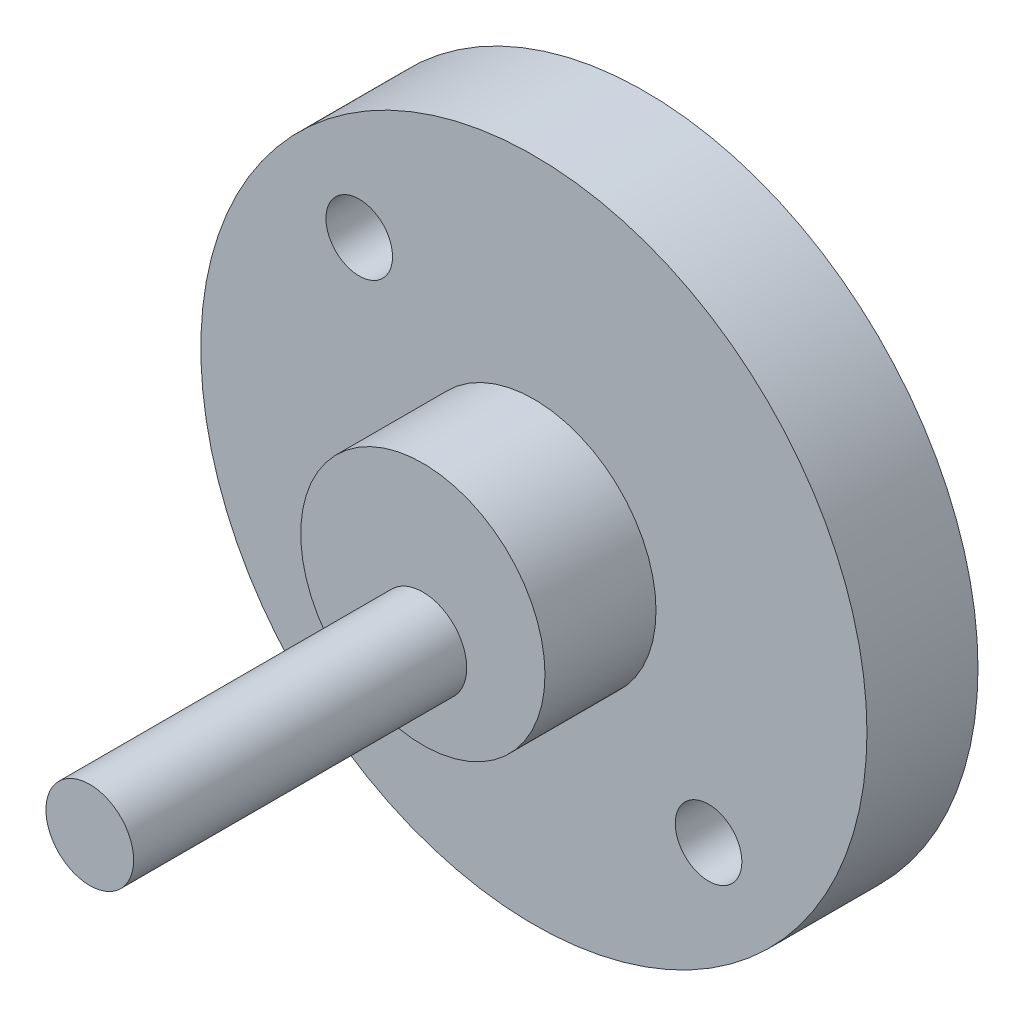
ISO-10303-21;
HEADER;
FILE_DESCRIPTION(('STEP AP214'),'2;1');
FILE_NAME('part.step','',(''),(''),'','','');
FILE_SCHEMA(('AUTOMOTIVE_DESIGN { 1 0 10303 214 1 1 1 1 }'));
ENDSEC;
DATA;
#1=APPLICATION_CONTEXT('core data for automotive mechanical design processes');
#2=APPLICATION_PROTOCOL_DEFINITION('international standard','automotive_design',2000,#1);
#3=PRODUCT_CONTEXT('',#1,'mechanical');
#4=PRODUCT('Part','Part','',(#3));
#5=PRODUCT_RELATED_PRODUCT_CATEGORY('part','',(#4));
#6=PRODUCT_DEFINITION_FORMATION('','',#4);
#7=PRODUCT_DEFINITION_CONTEXT('part definition',#1,'design');
#8=PRODUCT_DEFINITION('design','',#6,#7);
#9=PRODUCT_DEFINITION_SHAPE('','',#8);
#10=(LENGTH_UNIT() NAMED_UNIT(*) SI_UNIT(.MILLI.,.METRE.));
#11=(NAMED_UNIT(*) PLANE_ANGLE_UNIT() SI_UNIT($,.RADIAN.));
#12=(NAMED_UNIT(*) SI_UNIT($,.STERADIAN.) SOLID_ANGLE_UNIT());
#13=UNCERTAINTY_MEASURE_WITH_UNIT(LENGTH_MEASURE(1.E-05),#10,'distance_accuracy_value','');
#14=(GEOMETRIC_REPRESENTATION_CONTEXT(3) GLOBAL_UNCERTAINTY_ASSIGNED_CONTEXT((#13)) GLOBAL_UNIT_ASSIGNED_CONTEXT((#10,
#11,#12)) REPRESENTATION_CONTEXT('',''));
#15=CARTESIAN_POINT('',(0.,0.,0.));
#16=DIRECTION('',(0.,0.,1.));
#17=DIRECTION('',(1.,0.,0.));
#18=AXIS2_PLACEMENT_3D('',#15,#16,#17);
#19=CARTESIAN_POINT('',(0.,0.,20.));
#20=DIRECTION('',(0.,0.,1.));
#21=DIRECTION('',(1.,0.,0.));
#22=AXIS2_PLACEMENT_3D('',#19,#20,#21);
#23=PLANE('',#22);
#24=CARTESIAN_POINT('',(0.,0.,20.));
#25=DIRECTION('',(0.,0.,1.));
#26=DIRECTION('',(1.,0.,0.));
#27=AXIS2_PLACEMENT_3D('',#24,#25,#26);
#28=CIRCLE('',#27,11.);
#29=CARTESIAN_POINT('',(11.,0.,20.));
#30=VERTEX_POINT('',#29);
#31=EDGE_CURVE('E60',#30,#30,#28,.T.);
#32=ORIENTED_EDGE('',*,*,#31,.T.);
#33=EDGE_LOOP('',(#32));
#34=FACE_BOUND('',#33,.T.);
#35=CARTESIAN_POINT('',(0.,-3.,20.));
#36=DIRECTION('',(0.,0.,1.));
#37=DIRECTION('',(1.,0.,0.));
#38=AXIS2_PLACEMENT_3D('',#35,#36,#37);
#39=CIRCLE('',#38,3.95);
#40=CARTESIAN_POINT('',(3.95,-3.,20.));
#41=VERTEX_POINT('',#40);
#42=EDGE_CURVE('E67',#41,#41,#39,.T.);
#43=ORIENTED_EDGE('',*,*,#42,.F.);
#44=EDGE_LOOP('',(#43));
#45=FACE_BOUND('',#44,.T.);
#46=ADVANCED_FACE('F30',(#34,#45),#23,.T.);
#47=CARTESIAN_POINT('',(0.,0.,10.));
#48=DIRECTION('',(0.,0.,1.));
#49=DIRECTION('',(1.,0.,0.));
#50=AXIS2_PLACEMENT_3D('',#47,#48,#49);
#51=PLANE('',#50);
#52=CARTESIAN_POINT('',(0.,0.,10.));
#53=DIRECTION('',(0.,0.,1.));
#54=DIRECTION('',(1.,0.,0.));
#55=AXIS2_PLACEMENT_3D('',#52,#53,#54);
#56=CIRCLE('',#55,30.);
#57=CARTESIAN_POINT('',(30.,0.,10.));
#58=VERTEX_POINT('',#57);
#59=EDGE_CURVE('E10',#58,#58,#56,.T.);
#60=ORIENTED_EDGE('',*,*,#59,.T.);
#61=EDGE_LOOP('',(#60));
#62=FACE_BOUND('',#61,.T.);
#63=CARTESIAN_POINT('',(-15.7331258814007,-15.7331258814007,10.));
#64=DIRECTION('',(0.,0.,1.));
#65=DIRECTION('',(1.,0.,0.));
#66=AXIS2_PLACEMENT_3D('',#63,#64,#65);
#67=CIRCLE('',#66,3.);
#68=CARTESIAN_POINT('',(-12.7331258814007,-15.7331258814007,10.));
#69=VERTEX_POINT('',#68);
#70=EDGE_CURVE('E45',#69,#69,#67,.T.);
#71=ORIENTED_EDGE('',*,*,#70,.F.);
#72=EDGE_LOOP('',(#71));
#73=FACE_BOUND('',#72,.T.);
#74=CARTESIAN_POINT('',(15.7331258814007,-15.7331258814007,10.));
#75=DIRECTION('',(0.,0.,1.));
#76=DIRECTION('',(1.,0.,0.));
#77=AXIS2_PLACEMENT_3D('',#74,#75,#76);
#78=CIRCLE('',#77,3.);
#79=CARTESIAN_POINT('',(18.7331258814007,-15.7331258814007,10.));
#80=VERTEX_POINT('',#79);
#81=EDGE_CURVE('E51',#80,#80,#78,.T.);
#82=ORIENTED_EDGE('',*,*,#81,.F.);
#83=EDGE_LOOP('',(#82));
#84=FACE_BOUND('',#83,.T.);
#85=CARTESIAN_POINT('',(-15.7331258814007,15.7331258814007,10.));
#86=DIRECTION('',(0.,0.,1.));
#87=DIRECTION('',(1.,0.,0.));
#88=AXIS2_PLACEMENT_3D('',#85,#86,#87);
#89=CIRCLE('',#88,3.);
#90=CARTESIAN_POINT('',(-12.7331258814007,15.7331258814007,10.));
#91=VERTEX_POINT('',#90);
#92=EDGE_CURVE('E57',#91,#91,#89,.T.);
#93=ORIENTED_EDGE('',*,*,#92,.F.);
#94=EDGE_LOOP('',(#93));
#95=FACE_BOUND('',#94,.T.);
#96=CARTESIAN_POINT('',(0.,0.,10.));
#97=DIRECTION('',(0.,0.,1.));
#98=DIRECTION('',(1.,0.,0.));
#99=AXIS2_PLACEMENT_3D('',#96,#97,#98);
#100=CIRCLE('',#99,11.);
#101=CARTESIAN_POINT('',(11.,0.,10.));
#102=VERTEX_POINT('',#101);
#103=EDGE_CURVE('E61',#102,#102,#100,.T.);
#104=ORIENTED_EDGE('',*,*,#103,.F.);
#105=EDGE_LOOP('',(#104));
#106=FACE_BOUND('',#105,.T.);
#107=ADVANCED_FACE('F83',(#62,#73,#84,#95,#106),#51,.T.);
#108=CARTESIAN_POINT('',(0.,0.,10.));
#109=DIRECTION('',(0.,0.,-1.));
#110=DIRECTION('',(-1.,0.,0.));
#111=AXIS2_PLACEMENT_3D('',#108,#109,#110);
#112=CYLINDRICAL_SURFACE('',#111,30.);
#113=ORIENTED_EDGE('',*,*,#59,.F.);
#114=EDGE_LOOP('',(#113));
#115=FACE_BOUND('',#114,.T.);
#116=CARTESIAN_POINT('',(0.,0.,0.));
#117=DIRECTION('',(0.,0.,1.));
#118=DIRECTION('',(1.,0.,0.));
#119=AXIS2_PLACEMENT_3D('',#116,#117,#118);
#120=CIRCLE('',#119,30.);
#121=CARTESIAN_POINT('',(30.,0.,0.));
#122=VERTEX_POINT('',#121);
#123=EDGE_CURVE('E34',#122,#122,#120,.T.);
#124=ORIENTED_EDGE('',*,*,#123,.T.);
#125=EDGE_LOOP('',(#124));
#126=FACE_BOUND('',#125,.T.);
#127=ADVANCED_FACE('F32',(#115,#126),#112,.T.);
#128=CARTESIAN_POINT('',(0.,0.,0.));
#129=DIRECTION('',(0.,0.,1.));
#130=DIRECTION('',(1.,0.,0.));
#131=AXIS2_PLACEMENT_3D('',#128,#129,#130);
#132=PLANE('',#131);
#133=CARTESIAN_POINT('',(-15.7331258814007,15.7331258814007,0.));
#134=DIRECTION('',(0.,0.,1.));
#135=DIRECTION('',(1.,0.,0.));
#136=AXIS2_PLACEMENT_3D('',#133,#134,#135);
#137=CIRCLE('',#136,3.);
#138=CARTESIAN_POINT('',(-12.7331258814007,15.7331258814007,0.));
#139=VERTEX_POINT('',#138);
#140=EDGE_CURVE('E54',#139,#139,#137,.T.);
#141=ORIENTED_EDGE('',*,*,#140,.T.);
#142=EDGE_LOOP('',(#141));
#143=FACE_BOUND('',#142,.T.);
#144=CARTESIAN_POINT('',(15.7331258814007,-15.7331258814007,0.));
#145=DIRECTION('',(0.,0.,1.));
#146=DIRECTION('',(1.,0.,0.));
#147=AXIS2_PLACEMENT_3D('',#144,#145,#146);
#148=CIRCLE('',#147,3.);
#149=CARTESIAN_POINT('',(18.7331258814007,-15.7331258814007,0.));
#150=VERTEX_POINT('',#149);
#151=EDGE_CURVE('E48',#150,#150,#148,.T.);
#152=ORIENTED_EDGE('',*,*,#151,.T.);
#153=EDGE_LOOP('',(#152));
#154=FACE_BOUND('',#153,.T.);
#155=CARTESIAN_POINT('',(-15.7331258814007,-15.7331258814007,0.));
#156=DIRECTION('',(0.,0.,1.));
#157=DIRECTION('',(1.,0.,0.));
#158=AXIS2_PLACEMENT_3D('',#155,#156,#157);
#159=CIRCLE('',#158,3.);
#160=CARTESIAN_POINT('',(-12.7331258814007,-15.7331258814007,0.));
#161=VERTEX_POINT('',#160);
#162=EDGE_CURVE('E41',#161,#161,#159,.T.);
#163=ORIENTED_EDGE('',*,*,#162,.T.);
#164=EDGE_LOOP('',(#163));
#165=FACE_BOUND('',#164,.T.);
#166=ORIENTED_EDGE('',*,*,#123,.F.);
#167=EDGE_LOOP('',(#166));
#168=FACE_BOUND('',#167,.T.);
#169=ADVANCED_FACE('F105',(#143,#154,#165,#168),#132,.F.);
#170=CARTESIAN_POINT('',(-15.7331258814007,-15.7331258814007,10.));
#171=DIRECTION('',(0.,0.,1.));
#172=DIRECTION('',(1.,0.,0.));
#173=AXIS2_PLACEMENT_3D('',#170,#171,#172);
#174=CYLINDRICAL_SURFACE('',#173,3.);
#175=ORIENTED_EDGE('',*,*,#162,.F.);
#176=EDGE_LOOP('',(#175));
#177=FACE_BOUND('',#176,.T.);
#178=ORIENTED_EDGE('',*,*,#70,.T.);
#179=EDGE_LOOP('',(#178));
#180=FACE_BOUND('',#179,.T.);
#181=ADVANCED_FACE('F102',(#177,#180),#174,.F.);
#182=CARTESIAN_POINT('',(15.7331258814007,-15.7331258814007,10.));
#183=DIRECTION('',(0.,0.,1.));
#184=DIRECTION('',(1.,0.,0.));
#185=AXIS2_PLACEMENT_3D('',#182,#183,#184);
#186=CYLINDRICAL_SURFACE('',#185,3.);
#187=ORIENTED_EDGE('',*,*,#151,.F.);
#188=EDGE_LOOP('',(#187));
#189=FACE_BOUND('',#188,.T.);
#190=ORIENTED_EDGE('',*,*,#81,.T.);
#191=EDGE_LOOP('',(#190));
#192=FACE_BOUND('',#191,.T.);
#193=ADVANCED_FACE('F98',(#189,#192),#186,.F.);
#194=CARTESIAN_POINT('',(-15.7331258814007,15.7331258814007,10.));
#195=DIRECTION('',(0.,0.,1.));
#196=DIRECTION('',(1.,0.,0.));
#197=AXIS2_PLACEMENT_3D('',#194,#195,#196);
#198=CYLINDRICAL_SURFACE('',#197,3.);
#199=ORIENTED_EDGE('',*,*,#140,.F.);
#200=EDGE_LOOP('',(#199));
#201=FACE_BOUND('',#200,.T.);
#202=ORIENTED_EDGE('',*,*,#92,.T.);
#203=EDGE_LOOP('',(#202));
#204=FACE_BOUND('',#203,.T.);
#205=ADVANCED_FACE('F94',(#201,#204),#198,.F.);
#206=CARTESIAN_POINT('',(0.,0.,20.));
#207=DIRECTION('',(0.,0.,-1.));
#208=DIRECTION('',(-1.,0.,0.));
#209=AXIS2_PLACEMENT_3D('',#206,#207,#208);
#210=CYLINDRICAL_SURFACE('',#209,11.);
#211=ORIENTED_EDGE('',*,*,#31,.F.);
#212=EDGE_LOOP('',(#211));
#213=FACE_BOUND('',#212,.T.);
#214=ORIENTED_EDGE('',*,*,#103,.T.);
#215=EDGE_LOOP('',(#214));
#216=FACE_BOUND('',#215,.T.);
#217=ADVANCED_FACE('F78',(#213,#216),#210,.T.);
#218=CARTESIAN_POINT('',(0.,-3.,50.));
#219=DIRECTION('',(0.,0.,-1.));
#220=DIRECTION('',(-1.,0.,0.));
#221=AXIS2_PLACEMENT_3D('',#218,#219,#220);
#222=CYLINDRICAL_SURFACE('',#221,3.95);
#223=CARTESIAN_POINT('',(0.,-3.,50.));
#224=DIRECTION('',(0.,0.,1.));
#225=DIRECTION('',(1.,0.,0.));
#226=AXIS2_PLACEMENT_3D('',#223,#224,#225);
#227=CIRCLE('',#226,3.95);
#228=CARTESIAN_POINT('',(3.95,-3.,50.));
#229=VERTEX_POINT('',#228);
#230=EDGE_CURVE('E64',#229,#229,#227,.T.);
#231=ORIENTED_EDGE('',*,*,#230,.F.);
#232=EDGE_LOOP('',(#231));
#233=FACE_BOUND('',#232,.T.);
#234=ORIENTED_EDGE('',*,*,#42,.T.);
#235=EDGE_LOOP('',(#234));
#236=FACE_BOUND('',#235,.T.);
#237=ADVANCED_FACE('F75',(#233,#236),#222,.T.);
#238=CARTESIAN_POINT('',(0.,-3.,50.));
#239=DIRECTION('',(0.,0.,1.));
#240=DIRECTION('',(1.,0.,0.));
#241=AXIS2_PLACEMENT_3D('',#238,#239,#240);
#242=PLANE('',#241);
#243=ORIENTED_EDGE('',*,*,#230,.T.);
#244=EDGE_LOOP('',(#243));
#245=FACE_BOUND('',#244,.T.);
#246=ADVANCED_FACE('F73',(#245),#242,.T.);
#247=CLOSED_SHELL('',(#46,#107,#127,#169,#181,#193,#205,#217,#237,#246));
#248=MANIFOLD_SOLID_BREP('B2',#247);
#249=ADVANCED_BREP_SHAPE_REPRESENTATION('',(#18,#248),#14);
#250=SHAPE_DEFINITION_REPRESENTATION(#9,#249);
ENDSEC;
END-ISO-10303-21;
